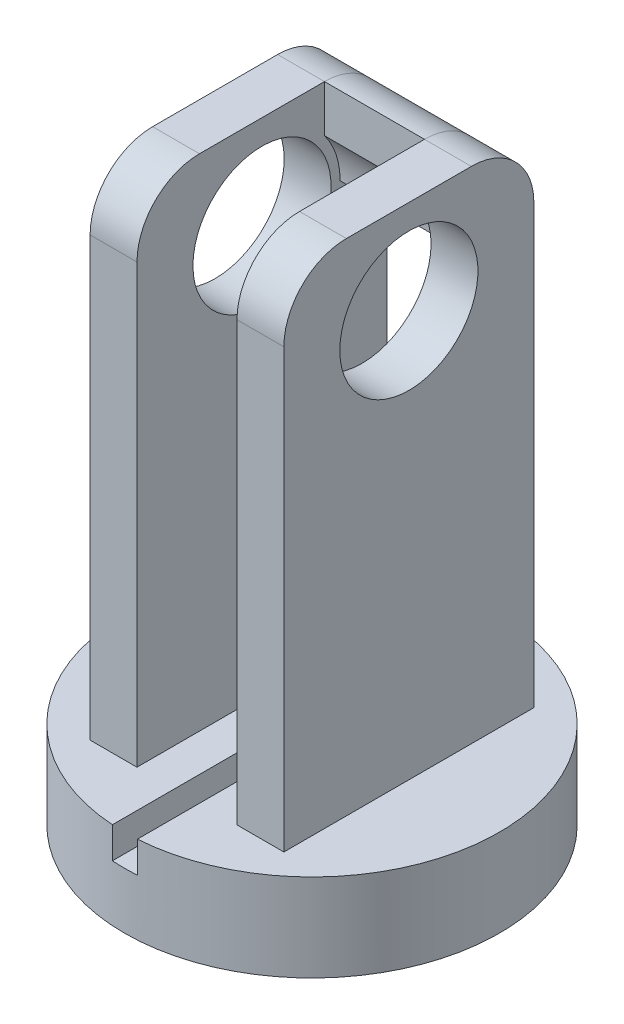
ISO-10303-21;
HEADER;
FILE_DESCRIPTION(('STEP AP214'),'2;1');
FILE_NAME('part.step','',(''),(''),'','','');
FILE_SCHEMA(('AUTOMOTIVE_DESIGN { 1 0 10303 214 1 1 1 1 }'));
ENDSEC;
DATA;
#1=APPLICATION_CONTEXT('core data for automotive mechanical design processes');
#2=APPLICATION_PROTOCOL_DEFINITION('international standard','automotive_design',2000,#1);
#3=PRODUCT_CONTEXT('',#1,'mechanical');
#4=PRODUCT('Part','Part','',(#3));
#5=PRODUCT_RELATED_PRODUCT_CATEGORY('part','',(#4));
#6=PRODUCT_DEFINITION_FORMATION('','',#4);
#7=PRODUCT_DEFINITION_CONTEXT('part definition',#1,'design');
#8=PRODUCT_DEFINITION('design','',#6,#7);
#9=PRODUCT_DEFINITION_SHAPE('','',#8);
#10=(LENGTH_UNIT() NAMED_UNIT(*) SI_UNIT(.MILLI.,.METRE.));
#11=(NAMED_UNIT(*) PLANE_ANGLE_UNIT() SI_UNIT($,.RADIAN.));
#12=(NAMED_UNIT(*) SI_UNIT($,.STERADIAN.) SOLID_ANGLE_UNIT());
#13=UNCERTAINTY_MEASURE_WITH_UNIT(LENGTH_MEASURE(1.E-05),#10,'distance_accuracy_value','');
#14=(GEOMETRIC_REPRESENTATION_CONTEXT(3) GLOBAL_UNCERTAINTY_ASSIGNED_CONTEXT((#13)) GLOBAL_UNIT_ASSIGNED_CONTEXT((#10,
#11,#12)) REPRESENTATION_CONTEXT('',''));
#15=CARTESIAN_POINT('',(0.,0.,0.));
#16=DIRECTION('',(0.,0.,1.));
#17=DIRECTION('',(1.,0.,0.));
#18=AXIS2_PLACEMENT_3D('',#15,#16,#17);
#19=CARTESIAN_POINT('',(-8.,94.,20.));
#20=DIRECTION('',(-1.,0.,0.));
#21=DIRECTION('',(0.,0.,1.));
#22=AXIS2_PLACEMENT_3D('',#19,#20,#21);
#23=PLANE('',#22);
#24=CARTESIAN_POINT('',(-8.,79.,0.));
#25=DIRECTION('',(-1.,0.,0.));
#26=DIRECTION('',(0.,0.,1.));
#27=AXIS2_PLACEMENT_3D('',#24,#25,#26);
#28=CIRCLE('',#27,11.05);
#29=CARTESIAN_POINT('',(-8.,79.,11.05));
#30=VERTEX_POINT('',#29);
#31=EDGE_CURVE('E255',#30,#30,#28,.T.);
#32=ORIENTED_EDGE('',*,*,#31,.T.);
#33=EDGE_LOOP('',(#32));
#34=FACE_BOUND('',#33,.T.);
#35=DIRECTION('',(0.,1.,0.));
#36=VECTOR('',#35,1.);
#37=CARTESIAN_POINT('',(-8.,86.5,-9.99999999999999));
#38=LINE('',#37,#36);
#39=CARTESIAN_POINT('',(-8.,86.5,-9.99999999999999));
#40=VERTEX_POINT('',#39);
#41=CARTESIAN_POINT('',(-8.,94.,-9.99999999999999));
#42=VERTEX_POINT('',#41);
#43=EDGE_CURVE('E187',#40,#42,#38,.T.);
#44=ORIENTED_EDGE('',*,*,#43,.T.);
#45=DIRECTION('',(0.,0.,-1.));
#46=VECTOR('',#45,1.);
#47=CARTESIAN_POINT('',(-8.,94.,20.));
#48=LINE('',#47,#46);
#49=CARTESIAN_POINT('',(-8.,94.,10.));
#50=VERTEX_POINT('',#49);
#51=EDGE_CURVE('E180',#50,#42,#48,.T.);
#52=ORIENTED_EDGE('',*,*,#51,.F.);
#53=CARTESIAN_POINT('',(-8.,84.,10.));
#54=DIRECTION('',(-1.,0.,0.));
#55=DIRECTION('',(0.,0.,1.));
#56=AXIS2_PLACEMENT_3D('',#53,#54,#55);
#57=CIRCLE('',#56,10.);
#58=CARTESIAN_POINT('',(-8.,84.,20.));
#59=VERTEX_POINT('',#58);
#60=EDGE_CURVE('E203',#50,#59,#57,.F.);
#61=ORIENTED_EDGE('',*,*,#60,.T.);
#62=DIRECTION('',(0.,-1.,0.));
#63=VECTOR('',#62,1.);
#64=CARTESIAN_POINT('',(-8.,94.,20.));
#65=LINE('',#64,#63);
#66=CARTESIAN_POINT('',(-8.,14.,20.));
#67=VERTEX_POINT('',#66);
#68=EDGE_CURVE('E302',#59,#67,#65,.T.);
#69=ORIENTED_EDGE('',*,*,#68,.T.);
#70=DIRECTION('',(0.,0.,-1.));
#71=VECTOR('',#70,1.);
#72=CARTESIAN_POINT('',(-8.,14.,20.));
#73=LINE('',#72,#71);
#74=CARTESIAN_POINT('',(-8.,14.,-20.));
#75=VERTEX_POINT('',#74);
#76=EDGE_CURVE('E289',#67,#75,#73,.T.);
#77=ORIENTED_EDGE('',*,*,#76,.T.);
#78=DIRECTION('',(0.,-1.,0.));
#79=VECTOR('',#78,1.);
#80=CARTESIAN_POINT('',(-8.,94.,-20.));
#81=LINE('',#80,#79);
#82=CARTESIAN_POINT('',(-8.,79.,-20.));
#83=VERTEX_POINT('',#82);
#84=EDGE_CURVE('E300',#83,#75,#81,.T.);
#85=ORIENTED_EDGE('',*,*,#84,.F.);
#86=DIRECTION('',(0.,0.,-1.));
#87=VECTOR('',#86,1.);
#88=CARTESIAN_POINT('',(-8.,79.,-12.5));
#89=LINE('',#88,#87);
#90=CARTESIAN_POINT('',(-8.,79.,-12.5));
#91=VERTEX_POINT('',#90);
#92=EDGE_CURVE('E53',#91,#83,#89,.T.);
#93=ORIENTED_EDGE('',*,*,#92,.F.);
#94=CARTESIAN_POINT('',(-8.,79.,0.));
#95=DIRECTION('',(-1.,0.,0.));
#96=DIRECTION('',(0.,0.,1.));
#97=AXIS2_PLACEMENT_3D('',#94,#95,#96);
#98=CIRCLE('',#97,12.5);
#99=EDGE_CURVE('E48',#40,#91,#98,.T.);
#100=ORIENTED_EDGE('',*,*,#99,.F.);
#101=EDGE_LOOP('',(#44,#52,#61,#69,#77,#85,#93,#100));
#102=FACE_BOUND('',#101,.T.);
#103=ADVANCED_FACE('F33',(#34,#102),#23,.F.);
#104=CARTESIAN_POINT('',(8.,94.,-20.));
#105=DIRECTION('',(1.,0.,0.));
#106=DIRECTION('',(0.,0.,-1.));
#107=AXIS2_PLACEMENT_3D('',#104,#105,#106);
#108=PLANE('',#107);
#109=CARTESIAN_POINT('',(8.,79.,0.));
#110=DIRECTION('',(1.,0.,0.));
#111=DIRECTION('',(0.,0.,-1.));
#112=AXIS2_PLACEMENT_3D('',#109,#110,#111);
#113=CIRCLE('',#112,11.05);
#114=CARTESIAN_POINT('',(8.,79.,-11.05));
#115=VERTEX_POINT('',#114);
#116=EDGE_CURVE('E226',#115,#115,#113,.T.);
#117=ORIENTED_EDGE('',*,*,#116,.T.);
#118=EDGE_LOOP('',(#117));
#119=FACE_BOUND('',#118,.T.);
#120=DIRECTION('',(0.,1.,0.));
#121=VECTOR('',#120,1.);
#122=CARTESIAN_POINT('',(8.,86.5,-9.99999999999999));
#123=LINE('',#122,#121);
#124=CARTESIAN_POINT('',(8.,86.5,-9.99999999999999));
#125=VERTEX_POINT('',#124);
#126=CARTESIAN_POINT('',(8.,94.,-10.));
#127=VERTEX_POINT('',#126);
#128=EDGE_CURVE('E197',#125,#127,#123,.T.);
#129=ORIENTED_EDGE('',*,*,#128,.F.);
#130=CARTESIAN_POINT('',(8.,79.,0.));
#131=DIRECTION('',(-1.,0.,0.));
#132=DIRECTION('',(0.,0.,1.));
#133=AXIS2_PLACEMENT_3D('',#130,#131,#132);
#134=CIRCLE('',#133,12.5);
#135=CARTESIAN_POINT('',(8.,79.,-12.5));
#136=VERTEX_POINT('',#135);
#137=EDGE_CURVE('E191',#125,#136,#134,.T.);
#138=ORIENTED_EDGE('',*,*,#137,.T.);
#139=DIRECTION('',(0.,0.,-1.));
#140=VECTOR('',#139,1.);
#141=CARTESIAN_POINT('',(8.,79.,-12.5));
#142=LINE('',#141,#140);
#143=CARTESIAN_POINT('',(8.,79.,-20.));
#144=VERTEX_POINT('',#143);
#145=EDGE_CURVE('E200',#136,#144,#142,.T.);
#146=ORIENTED_EDGE('',*,*,#145,.T.);
#147=DIRECTION('',(0.,-1.,0.));
#148=VECTOR('',#147,1.);
#149=CARTESIAN_POINT('',(8.,94.,-20.));
#150=LINE('',#149,#148);
#151=CARTESIAN_POINT('',(8.,14.,-20.));
#152=VERTEX_POINT('',#151);
#153=EDGE_CURVE('E278',#144,#152,#150,.T.);
#154=ORIENTED_EDGE('',*,*,#153,.T.);
#155=DIRECTION('',(0.,0.,1.));
#156=VECTOR('',#155,1.);
#157=CARTESIAN_POINT('',(8.,14.,-20.));
#158=LINE('',#157,#156);
#159=CARTESIAN_POINT('',(8.,14.,20.));
#160=VERTEX_POINT('',#159);
#161=EDGE_CURVE('E263',#152,#160,#158,.T.);
#162=ORIENTED_EDGE('',*,*,#161,.T.);
#163=DIRECTION('',(0.,-1.,0.));
#164=VECTOR('',#163,1.);
#165=CARTESIAN_POINT('',(8.,94.,20.));
#166=LINE('',#165,#164);
#167=CARTESIAN_POINT('',(8.,84.,20.));
#168=VERTEX_POINT('',#167);
#169=EDGE_CURVE('E266',#168,#160,#166,.T.);
#170=ORIENTED_EDGE('',*,*,#169,.F.);
#171=CARTESIAN_POINT('',(8.,84.,10.));
#172=DIRECTION('',(1.,0.,0.));
#173=DIRECTION('',(0.,0.,-1.));
#174=AXIS2_PLACEMENT_3D('',#171,#172,#173);
#175=CIRCLE('',#174,10.);
#176=CARTESIAN_POINT('',(8.,94.,10.));
#177=VERTEX_POINT('',#176);
#178=EDGE_CURVE('E214',#168,#177,#175,.F.);
#179=ORIENTED_EDGE('',*,*,#178,.T.);
#180=DIRECTION('',(0.,0.,1.));
#181=VECTOR('',#180,1.);
#182=CARTESIAN_POINT('',(8.,94.,-20.));
#183=LINE('',#182,#181);
#184=EDGE_CURVE('E262',#127,#177,#183,.T.);
#185=ORIENTED_EDGE('',*,*,#184,.F.);
#186=EDGE_LOOP('',(#129,#138,#146,#154,#162,#170,#179,#185));
#187=FACE_BOUND('',#186,.T.);
#188=ADVANCED_FACE('F395',(#119,#187),#108,.F.);
#189=CARTESIAN_POINT('',(0.,14.,0.));
#190=DIRECTION('',(0.,1.,0.));
#191=DIRECTION('',(0.,0.,1.));
#192=AXIS2_PLACEMENT_3D('',#189,#190,#191);
#193=PLANE('',#192);
#194=DIRECTION('',(0.,0.,-1.));
#195=VECTOR('',#194,1.);
#196=CARTESIAN_POINT('',(2.,14.,-29.9332590941915));
#197=LINE('',#196,#195);
#198=CARTESIAN_POINT('',(2.,14.,29.9332590941915));
#199=VERTEX_POINT('',#198);
#200=CARTESIAN_POINT('',(2.,14.,-29.9332590941915));
#201=VERTEX_POINT('',#200);
#202=EDGE_CURVE('E245',#199,#201,#197,.T.);
#203=ORIENTED_EDGE('',*,*,#202,.F.);
#204=CARTESIAN_POINT('',(0.,14.,0.));
#205=DIRECTION('',(0.,1.,0.));
#206=DIRECTION('',(0.,0.,1.));
#207=AXIS2_PLACEMENT_3D('',#204,#205,#206);
#208=CIRCLE('',#207,30.);
#209=EDGE_CURVE('E311',#199,#201,#208,.T.);
#210=ORIENTED_EDGE('',*,*,#209,.T.);
#211=EDGE_LOOP('',(#203,#210));
#212=FACE_BOUND('',#211,.T.);
#213=DIRECTION('',(0.,0.,-1.));
#214=VECTOR('',#213,1.);
#215=CARTESIAN_POINT('',(15.5,14.,20.));
#216=LINE('',#215,#214);
#217=CARTESIAN_POINT('',(15.5,14.,20.));
#218=VERTEX_POINT('',#217);
#219=CARTESIAN_POINT('',(15.5,14.,-20.));
#220=VERTEX_POINT('',#219);
#221=EDGE_CURVE('E269',#218,#220,#216,.T.);
#222=ORIENTED_EDGE('',*,*,#221,.F.);
#223=DIRECTION('',(1.,0.,0.));
#224=VECTOR('',#223,1.);
#225=CARTESIAN_POINT('',(8.,14.,20.));
#226=LINE('',#225,#224);
#227=EDGE_CURVE('E258',#160,#218,#226,.T.);
#228=ORIENTED_EDGE('',*,*,#227,.F.);
#229=ORIENTED_EDGE('',*,*,#161,.F.);
#230=DIRECTION('',(-1.,0.,0.));
#231=VECTOR('',#230,1.);
#232=CARTESIAN_POINT('',(15.5,14.,-20.));
#233=LINE('',#232,#231);
#234=EDGE_CURVE('E272',#220,#152,#233,.T.);
#235=ORIENTED_EDGE('',*,*,#234,.F.);
#236=EDGE_LOOP('',(#222,#228,#229,#235));
#237=FACE_BOUND('',#236,.T.);
#238=ADVANCED_FACE('F373',(#212,#237),#193,.T.);
#239=DIRECTION('',(0.,0.,1.));
#240=VECTOR('',#239,1.);
#241=CARTESIAN_POINT('',(-2.,14.,-29.9332590941915));
#242=LINE('',#241,#240);
#243=CARTESIAN_POINT('',(-2.,14.,-29.9332590941915));
#244=VERTEX_POINT('',#243);
#245=CARTESIAN_POINT('',(-2.,14.,29.9332590941915));
#246=VERTEX_POINT('',#245);
#247=EDGE_CURVE('E344',#244,#246,#242,.T.);
#248=ORIENTED_EDGE('',*,*,#247,.F.);
#249=EDGE_CURVE('E313',#244,#246,#208,.T.);
#250=ORIENTED_EDGE('',*,*,#249,.T.);
#251=EDGE_LOOP('',(#248,#250));
#252=FACE_BOUND('',#251,.T.);
#253=ORIENTED_EDGE('',*,*,#76,.F.);
#254=DIRECTION('',(1.,0.,0.));
#255=VECTOR('',#254,1.);
#256=CARTESIAN_POINT('',(-15.5,14.,20.));
#257=LINE('',#256,#255);
#258=CARTESIAN_POINT('',(-15.5,14.,20.));
#259=VERTEX_POINT('',#258);
#260=EDGE_CURVE('E283',#259,#67,#257,.T.);
#261=ORIENTED_EDGE('',*,*,#260,.F.);
#262=DIRECTION('',(0.,0.,1.));
#263=VECTOR('',#262,1.);
#264=CARTESIAN_POINT('',(-15.5,14.,-20.));
#265=LINE('',#264,#263);
#266=CARTESIAN_POINT('',(-15.5,14.,-20.));
#267=VERTEX_POINT('',#266);
#268=EDGE_CURVE('E184',#267,#259,#265,.T.);
#269=ORIENTED_EDGE('',*,*,#268,.F.);
#270=DIRECTION('',(-1.,0.,0.));
#271=VECTOR('',#270,1.);
#272=CARTESIAN_POINT('',(-8.,14.,-20.));
#273=LINE('',#272,#271);
#274=EDGE_CURVE('E292',#75,#267,#273,.T.);
#275=ORIENTED_EDGE('',*,*,#274,.F.);
#276=EDGE_LOOP('',(#253,#261,#269,#275));
#277=FACE_BOUND('',#276,.T.);
#278=ADVANCED_FACE('F337',(#252,#277),#193,.T.);
#279=CARTESIAN_POINT('',(0.,14.,0.));
#280=DIRECTION('',(0.,-1.,0.));
#281=DIRECTION('',(0.,0.,-1.));
#282=AXIS2_PLACEMENT_3D('',#279,#280,#281);
#283=CYLINDRICAL_SURFACE('',#282,30.);
#284=CARTESIAN_POINT('',(0.,9.,0.));
#285=DIRECTION('',(0.,1.,0.));
#286=DIRECTION('',(0.,0.,1.));
#287=AXIS2_PLACEMENT_3D('',#284,#285,#286);
#288=CIRCLE('',#287,30.);
#289=CARTESIAN_POINT('',(2.,9.,-29.9332590941915));
#290=VERTEX_POINT('',#289);
#291=CARTESIAN_POINT('',(-2.,9.,-29.9332590941915));
#292=VERTEX_POINT('',#291);
#293=EDGE_CURVE('E356',#290,#292,#288,.T.);
#294=ORIENTED_EDGE('',*,*,#293,.F.);
#295=DIRECTION('',(0.,1.,0.));
#296=VECTOR('',#295,1.);
#297=CARTESIAN_POINT('',(2.,9.,-29.9332590941915));
#298=LINE('',#297,#296);
#299=EDGE_CURVE('E229',#290,#201,#298,.T.);
#300=ORIENTED_EDGE('',*,*,#299,.T.);
#301=ORIENTED_EDGE('',*,*,#209,.F.);
#302=DIRECTION('',(0.,1.,0.));
#303=VECTOR('',#302,1.);
#304=CARTESIAN_POINT('',(2.,9.,29.9332590941915));
#305=LINE('',#304,#303);
#306=CARTESIAN_POINT('',(2.,9.,29.9332590941915));
#307=VERTEX_POINT('',#306);
#308=EDGE_CURVE('E236',#307,#199,#305,.T.);
#309=ORIENTED_EDGE('',*,*,#308,.F.);
#310=CARTESIAN_POINT('',(0.,9.,0.));
#311=DIRECTION('',(0.,1.,0.));
#312=DIRECTION('',(0.,0.,1.));
#313=AXIS2_PLACEMENT_3D('',#310,#311,#312);
#314=CIRCLE('',#313,30.);
#315=CARTESIAN_POINT('',(-2.,9.,29.9332590941915));
#316=VERTEX_POINT('',#315);
#317=EDGE_CURVE('E361',#316,#307,#314,.T.);
#318=ORIENTED_EDGE('',*,*,#317,.F.);
#319=DIRECTION('',(0.,1.,0.));
#320=VECTOR('',#319,1.);
#321=CARTESIAN_POINT('',(-2.,9.,29.9332590941915));
#322=LINE('',#321,#320);
#323=EDGE_CURVE('E242',#316,#246,#322,.T.);
#324=ORIENTED_EDGE('',*,*,#323,.T.);
#325=ORIENTED_EDGE('',*,*,#249,.F.);
#326=DIRECTION('',(0.,1.,0.));
#327=VECTOR('',#326,1.);
#328=CARTESIAN_POINT('',(-2.,9.,-29.9332590941915));
#329=LINE('',#328,#327);
#330=EDGE_CURVE('E250',#292,#244,#329,.T.);
#331=ORIENTED_EDGE('',*,*,#330,.F.);
#332=EDGE_LOOP('',(#294,#300,#301,#309,#318,#324,#325,#331));
#333=FACE_BOUND('',#332,.T.);
#334=CARTESIAN_POINT('',(0.,0.,0.));
#335=DIRECTION('',(0.,1.,0.));
#336=DIRECTION('',(0.,0.,1.));
#337=AXIS2_PLACEMENT_3D('',#334,#335,#336);
#338=CIRCLE('',#337,30.);
#339=CARTESIAN_POINT('',(0.,0.,30.));
#340=VERTEX_POINT('',#339);
#341=EDGE_CURVE('E308',#340,#340,#338,.T.);
#342=ORIENTED_EDGE('',*,*,#341,.T.);
#343=EDGE_LOOP('',(#342));
#344=FACE_BOUND('',#343,.T.);
#345=ADVANCED_FACE('F375',(#333,#344),#283,.T.);
#346=CARTESIAN_POINT('',(0.,0.,0.));
#347=DIRECTION('',(0.,1.,0.));
#348=DIRECTION('',(0.,0.,1.));
#349=AXIS2_PLACEMENT_3D('',#346,#347,#348);
#350=PLANE('',#349);
#351=CARTESIAN_POINT('',(0.,0.,0.));
#352=DIRECTION('',(0.,-1.,0.));
#353=DIRECTION('',(0.,0.,-1.));
#354=AXIS2_PLACEMENT_3D('',#351,#352,#353);
#355=CIRCLE('',#354,11.05);
#356=CARTESIAN_POINT('',(0.,0.,-11.05));
#357=VERTEX_POINT('',#356);
#358=EDGE_CURVE('E304',#357,#357,#355,.T.);
#359=ORIENTED_EDGE('',*,*,#358,.F.);
#360=EDGE_LOOP('',(#359));
#361=FACE_BOUND('',#360,.T.);
#362=ORIENTED_EDGE('',*,*,#341,.F.);
#363=EDGE_LOOP('',(#362));
#364=FACE_BOUND('',#363,.T.);
#365=ADVANCED_FACE('F414',(#361,#364),#350,.F.);
#366=CARTESIAN_POINT('',(0.,7.,0.));
#367=DIRECTION('',(0.,-1.,0.));
#368=DIRECTION('',(0.,0.,-1.));
#369=AXIS2_PLACEMENT_3D('',#366,#367,#368);
#370=CYLINDRICAL_SURFACE('',#369,11.05);
#371=CARTESIAN_POINT('',(0.,7.,0.));
#372=DIRECTION('',(0.,-1.,0.));
#373=DIRECTION('',(0.,0.,-1.));
#374=AXIS2_PLACEMENT_3D('',#371,#372,#373);
#375=CIRCLE('',#374,11.05);
#376=CARTESIAN_POINT('',(0.,7.,-11.05));
#377=VERTEX_POINT('',#376);
#378=EDGE_CURVE('E305',#377,#377,#375,.T.);
#379=CARTESIAN_POINT('',(0.,7.,-11.05));
#380=CARTESIAN_POINT('',(0.,6.92708333333333,-11.05));
#381=CARTESIAN_POINT('',(0.,6.85416666666667,-11.05));
#382=CARTESIAN_POINT('',(0.,6.70833333333333,-11.05));
#383=CARTESIAN_POINT('',(0.,6.63541666666667,-11.05));
#384=CARTESIAN_POINT('',(0.,6.48958333333333,-11.05));
#385=CARTESIAN_POINT('',(0.,6.41666666666667,-11.05));
#386=CARTESIAN_POINT('',(0.,6.27083333333333,-11.05));
#387=CARTESIAN_POINT('',(0.,6.19791666666667,-11.05));
#388=CARTESIAN_POINT('',(0.,6.05208333333333,-11.05));
#389=CARTESIAN_POINT('',(0.,5.97916666666667,-11.05));
#390=CARTESIAN_POINT('',(0.,5.83333333333333,-11.05));
#391=CARTESIAN_POINT('',(0.,5.76041666666667,-11.05));
#392=CARTESIAN_POINT('',(0.,5.61458333333333,-11.05));
#393=CARTESIAN_POINT('',(0.,5.54166666666667,-11.05));
#394=CARTESIAN_POINT('',(0.,5.39583333333333,-11.05));
#395=CARTESIAN_POINT('',(0.,5.32291666666667,-11.05));
#396=CARTESIAN_POINT('',(0.,5.17708333333333,-11.05));
#397=CARTESIAN_POINT('',(0.,5.10416666666667,-11.05));
#398=CARTESIAN_POINT('',(0.,4.95833333333333,-11.05));
#399=CARTESIAN_POINT('',(0.,4.88541666666667,-11.05));
#400=CARTESIAN_POINT('',(0.,4.73958333333333,-11.05));
#401=CARTESIAN_POINT('',(0.,4.66666666666667,-11.05));
#402=CARTESIAN_POINT('',(0.,4.52083333333333,-11.05));
#403=CARTESIAN_POINT('',(0.,4.44791666666667,-11.05));
#404=CARTESIAN_POINT('',(0.,4.30208333333333,-11.05));
#405=CARTESIAN_POINT('',(0.,4.22916666666667,-11.05));
#406=CARTESIAN_POINT('',(0.,4.08333333333333,-11.05));
#407=CARTESIAN_POINT('',(0.,4.01041666666667,-11.05));
#408=CARTESIAN_POINT('',(0.,3.86458333333333,-11.05));
#409=CARTESIAN_POINT('',(0.,3.79166666666667,-11.05));
#410=CARTESIAN_POINT('',(0.,3.64583333333333,-11.05));
#411=CARTESIAN_POINT('',(0.,3.57291666666667,-11.05));
#412=CARTESIAN_POINT('',(0.,3.42708333333333,-11.05));
#413=CARTESIAN_POINT('',(0.,3.35416666666667,-11.05));
#414=CARTESIAN_POINT('',(0.,3.20833333333333,-11.05));
#415=CARTESIAN_POINT('',(0.,3.13541666666667,-11.05));
#416=CARTESIAN_POINT('',(0.,2.98958333333333,-11.05));
#417=CARTESIAN_POINT('',(0.,2.91666666666667,-11.05));
#418=CARTESIAN_POINT('',(0.,2.77083333333333,-11.05));
#419=CARTESIAN_POINT('',(0.,2.69791666666667,-11.05));
#420=CARTESIAN_POINT('',(0.,2.55208333333333,-11.05));
#421=CARTESIAN_POINT('',(0.,2.47916666666667,-11.05));
#422=CARTESIAN_POINT('',(0.,2.33333333333333,-11.05));
#423=CARTESIAN_POINT('',(0.,2.26041666666667,-11.05));
#424=CARTESIAN_POINT('',(0.,2.11458333333333,-11.05));
#425=CARTESIAN_POINT('',(0.,2.04166666666667,-11.05));
#426=CARTESIAN_POINT('',(0.,1.89583333333333,-11.05));
#427=CARTESIAN_POINT('',(0.,1.82291666666667,-11.05));
#428=CARTESIAN_POINT('',(0.,1.67708333333333,-11.05));
#429=CARTESIAN_POINT('',(0.,1.60416666666667,-11.05));
#430=CARTESIAN_POINT('',(0.,1.45833333333333,-11.05));
#431=CARTESIAN_POINT('',(0.,1.38541666666667,-11.05));
#432=CARTESIAN_POINT('',(0.,1.23958333333333,-11.05));
#433=CARTESIAN_POINT('',(0.,1.16666666666667,-11.05));
#434=CARTESIAN_POINT('',(0.,1.02083333333333,-11.05));
#435=CARTESIAN_POINT('',(0.,0.947916666666668,-11.05));
#436=CARTESIAN_POINT('',(0.,0.802083333333334,-11.05));
#437=CARTESIAN_POINT('',(0.,0.729166666666667,-11.05));
#438=CARTESIAN_POINT('',(0.,0.583333333333334,-11.05));
#439=CARTESIAN_POINT('',(0.,0.510416666666668,-11.05));
#440=CARTESIAN_POINT('',(0.,0.364583333333335,-11.05));
#441=CARTESIAN_POINT('',(0.,0.291666666666668,-11.05));
#442=CARTESIAN_POINT('',(0.,0.145833333333334,-11.05));
#443=CARTESIAN_POINT('',(0.,0.0729166666666675,-11.05));
#444=CARTESIAN_POINT('',(0.,0.,-11.05));
#445=B_SPLINE_CURVE_WITH_KNOTS('',3,(#379,#380,#381,#382,#383,#384,#385,#386,#387,#388,#389,
#390,#391,#392,#393,#394,#395,#396,#397,#398,#399,#400,#401,#402,#403,#404,#405,#406,#407,#408,
#409,#410,#411,#412,#413,#414,#415,#416,#417,#418,#419,#420,#421,#422,#423,#424,#425,#426,#427,
#428,#429,#430,#431,#432,#433,#434,#435,#436,#437,#438,#439,#440,#441,#442,#443,#444),
.UNSPECIFIED.,.F.,.F.,(4,2,2,2,2,2,2,2,2,2,2,2,2,2,2,2,2,2,2,2,2,2,2,2,2,2,2,2,2,2,2,2,4),(0.,
0.21875,0.4375,0.656250000000001,0.875,1.09375,1.3125,1.53125,1.75,1.96875,2.1875,2.40625,2.625,
2.84375,3.0625,3.28125,3.5,3.71875,3.9375,4.15625,4.375,4.59375,4.8125,5.03125,5.25,5.46875,
5.6875,5.90625,6.125,6.34375,6.5625,6.78125,7.),.UNSPECIFIED.);
#446=EDGE_CURVE('BSEAM410',#377,#357,#445,.T.);
#447=ORIENTED_EDGE('',*,*,#378,.F.);
#448=ORIENTED_EDGE('',*,*,#358,.T.);
#449=ORIENTED_EDGE('',*,*,#446,.T.);
#450=ORIENTED_EDGE('',*,*,#446,.F.);
#451=EDGE_LOOP('',(#447,#449,#448,#450));
#452=FACE_BOUND('',#451,.T.);
#453=ADVANCED_FACE('F410',(#452),#370,.F.);
#454=CARTESIAN_POINT('',(0.,7.,0.));
#455=DIRECTION('',(0.,-1.,0.));
#456=DIRECTION('',(0.,0.,-1.));
#457=AXIS2_PLACEMENT_3D('',#454,#455,#456);
#458=PLANE('',#457);
#459=ORIENTED_EDGE('',*,*,#378,.T.);
#460=EDGE_LOOP('',(#459));
#461=FACE_BOUND('',#460,.T.);
#462=ADVANCED_FACE('F407',(#461),#458,.T.);
#463=CARTESIAN_POINT('',(-15.5,94.,20.));
#464=DIRECTION('',(0.,0.,-1.));
#465=DIRECTION('',(-1.,0.,0.));
#466=AXIS2_PLACEMENT_3D('',#463,#464,#465);
#467=PLANE('',#466);
#468=ORIENTED_EDGE('',*,*,#68,.F.);
#469=DIRECTION('',(1.,0.,0.));
#470=VECTOR('',#469,1.);
#471=CARTESIAN_POINT('',(-15.5,84.,20.));
#472=LINE('',#471,#470);
#473=CARTESIAN_POINT('',(-15.5,84.,20.));
#474=VERTEX_POINT('',#473);
#475=EDGE_CURVE('E41',#59,#474,#472,.F.);
#476=ORIENTED_EDGE('',*,*,#475,.T.);
#477=DIRECTION('',(0.,-1.,0.));
#478=VECTOR('',#477,1.);
#479=CARTESIAN_POINT('',(-15.5,94.,20.));
#480=LINE('',#479,#478);
#481=EDGE_CURVE('E286',#474,#259,#480,.T.);
#482=ORIENTED_EDGE('',*,*,#481,.T.);
#483=ORIENTED_EDGE('',*,*,#260,.T.);
#484=EDGE_LOOP('',(#468,#476,#482,#483));
#485=FACE_BOUND('',#484,.T.);
#486=ADVANCED_FACE('F334',(#485),#467,.F.);
#487=CARTESIAN_POINT('',(-8.,94.,-20.));
#488=DIRECTION('',(0.,0.,1.));
#489=DIRECTION('',(1.,0.,0.));
#490=AXIS2_PLACEMENT_3D('',#487,#488,#489);
#491=PLANE('',#490);
#492=DIRECTION('',(-1.,0.,0.));
#493=VECTOR('',#492,1.);
#494=CARTESIAN_POINT('',(-8.,84.,-20.));
#495=LINE('',#494,#493);
#496=CARTESIAN_POINT('',(-15.5,84.,-20.));
#497=VERTEX_POINT('',#496);
#498=CARTESIAN_POINT('',(-8.,84.,-20.));
#499=VERTEX_POINT('',#498);
#500=EDGE_CURVE('E208',#497,#499,#495,.F.);
#501=ORIENTED_EDGE('',*,*,#500,.T.);
#502=DIRECTION('',(1.,0.,0.));
#503=VECTOR('',#502,1.);
#504=CARTESIAN_POINT('',(8.,84.,-20.));
#505=LINE('',#504,#503);
#506=CARTESIAN_POINT('',(8.,84.,-20.));
#507=VERTEX_POINT('',#506);
#508=EDGE_CURVE('E11',#499,#507,#505,.T.);
#509=ORIENTED_EDGE('',*,*,#508,.T.);
#510=DIRECTION('',(-1.,0.,0.));
#511=VECTOR('',#510,1.);
#512=CARTESIAN_POINT('',(15.5,84.,-20.));
#513=LINE('',#512,#511);
#514=CARTESIAN_POINT('',(15.5,84.,-20.));
#515=VERTEX_POINT('',#514);
#516=EDGE_CURVE('E218',#507,#515,#513,.F.);
#517=ORIENTED_EDGE('',*,*,#516,.T.);
#518=DIRECTION('',(0.,-1.,0.));
#519=VECTOR('',#518,1.);
#520=CARTESIAN_POINT('',(15.5,94.,-20.));
#521=LINE('',#520,#519);
#522=EDGE_CURVE('E280',#515,#220,#521,.T.);
#523=ORIENTED_EDGE('',*,*,#522,.T.);
#524=ORIENTED_EDGE('',*,*,#234,.T.);
#525=ORIENTED_EDGE('',*,*,#153,.F.);
#526=DIRECTION('',(1.,0.,0.));
#527=VECTOR('',#526,1.);
#528=CARTESIAN_POINT('',(-26.0277563773199,79.,-20.));
#529=LINE('',#528,#527);
#530=EDGE_CURVE('E341',#83,#144,#529,.T.);
#531=ORIENTED_EDGE('',*,*,#530,.F.);
#532=ORIENTED_EDGE('',*,*,#84,.T.);
#533=ORIENTED_EDGE('',*,*,#274,.T.);
#534=DIRECTION('',(0.,-1.,0.));
#535=VECTOR('',#534,1.);
#536=CARTESIAN_POINT('',(-15.5,94.,-20.));
#537=LINE('',#536,#535);
#538=EDGE_CURVE('E298',#497,#267,#537,.T.);
#539=ORIENTED_EDGE('',*,*,#538,.F.);
#540=EDGE_LOOP('',(#501,#509,#517,#523,#524,#525,#531,#532,#533,#539));
#541=FACE_BOUND('',#540,.T.);
#542=ADVANCED_FACE('F320',(#541),#491,.F.);
#543=CARTESIAN_POINT('',(-15.5,94.,-20.));
#544=DIRECTION('',(1.,0.,0.));
#545=DIRECTION('',(0.,0.,-1.));
#546=AXIS2_PLACEMENT_3D('',#543,#544,#545);
#547=PLANE('',#546);
#548=CARTESIAN_POINT('',(-15.5,79.,0.));
#549=DIRECTION('',(1.,0.,0.));
#550=DIRECTION('',(0.,0.,-1.));
#551=AXIS2_PLACEMENT_3D('',#548,#549,#550);
#552=CIRCLE('',#551,11.05);
#553=CARTESIAN_POINT('',(-15.5,79.,-11.05));
#554=VERTEX_POINT('',#553);
#555=EDGE_CURVE('E233',#554,#554,#552,.T.);
#556=ORIENTED_EDGE('',*,*,#555,.T.);
#557=EDGE_LOOP('',(#556));
#558=FACE_BOUND('',#557,.T.);
#559=DIRECTION('',(0.,0.,1.));
#560=VECTOR('',#559,1.);
#561=CARTESIAN_POINT('',(-15.5,94.,-20.));
#562=LINE('',#561,#560);
#563=CARTESIAN_POINT('',(-15.5,94.,-10.));
#564=VERTEX_POINT('',#563);
#565=CARTESIAN_POINT('',(-15.5,94.,10.));
#566=VERTEX_POINT('',#565);
#567=EDGE_CURVE('E183',#564,#566,#562,.T.);
#568=ORIENTED_EDGE('',*,*,#567,.F.);
#569=CARTESIAN_POINT('',(-15.5,84.,-10.));
#570=DIRECTION('',(1.,0.,0.));
#571=DIRECTION('',(0.,0.,-1.));
#572=AXIS2_PLACEMENT_3D('',#569,#570,#571);
#573=CIRCLE('',#572,10.);
#574=EDGE_CURVE('E171',#564,#497,#573,.F.);
#575=ORIENTED_EDGE('',*,*,#574,.T.);
#576=ORIENTED_EDGE('',*,*,#538,.T.);
#577=ORIENTED_EDGE('',*,*,#268,.T.);
#578=ORIENTED_EDGE('',*,*,#481,.F.);
#579=CARTESIAN_POINT('',(-15.5,84.,10.));
#580=DIRECTION('',(1.,0.,0.));
#581=DIRECTION('',(0.,0.,-1.));
#582=AXIS2_PLACEMENT_3D('',#579,#580,#581);
#583=CIRCLE('',#582,10.);
#584=EDGE_CURVE('E175',#474,#566,#583,.F.);
#585=ORIENTED_EDGE('',*,*,#584,.T.);
#586=EDGE_LOOP('',(#568,#575,#576,#577,#578,#585));
#587=FACE_BOUND('',#586,.T.);
#588=ADVANCED_FACE('F325',(#558,#587),#547,.F.);
#589=CARTESIAN_POINT('',(0.,94.,0.));
#590=DIRECTION('',(0.,1.,0.));
#591=DIRECTION('',(0.,0.,1.));
#592=AXIS2_PLACEMENT_3D('',#589,#590,#591);
#593=PLANE('',#592);
#594=ORIENTED_EDGE('',*,*,#51,.T.);
#595=DIRECTION('',(-1.,0.,0.));
#596=VECTOR('',#595,1.);
#597=CARTESIAN_POINT('',(-15.5,94.,-10.));
#598=LINE('',#597,#596);
#599=EDGE_CURVE('E164',#42,#564,#598,.T.);
#600=ORIENTED_EDGE('',*,*,#599,.T.);
#601=ORIENTED_EDGE('',*,*,#567,.T.);
#602=DIRECTION('',(1.,0.,0.));
#603=VECTOR('',#602,1.);
#604=CARTESIAN_POINT('',(-7.99999999999999,94.,10.));
#605=LINE('',#604,#603);
#606=EDGE_CURVE('E176',#566,#50,#605,.T.);
#607=ORIENTED_EDGE('',*,*,#606,.T.);
#608=EDGE_LOOP('',(#594,#600,#601,#607));
#609=FACE_BOUND('',#608,.T.);
#610=ADVANCED_FACE('F181',(#609),#593,.T.);
#611=CARTESIAN_POINT('',(8.,94.,20.));
#612=DIRECTION('',(0.,0.,-1.));
#613=DIRECTION('',(-1.,0.,0.));
#614=AXIS2_PLACEMENT_3D('',#611,#612,#613);
#615=PLANE('',#614);
#616=DIRECTION('',(0.,-1.,0.));
#617=VECTOR('',#616,1.);
#618=CARTESIAN_POINT('',(15.5,94.,20.));
#619=LINE('',#618,#617);
#620=CARTESIAN_POINT('',(15.5,84.,20.));
#621=VERTEX_POINT('',#620);
#622=EDGE_CURVE('E282',#621,#218,#619,.T.);
#623=ORIENTED_EDGE('',*,*,#622,.F.);
#624=DIRECTION('',(1.,0.,0.));
#625=VECTOR('',#624,1.);
#626=CARTESIAN_POINT('',(8.,84.,20.));
#627=LINE('',#626,#625);
#628=EDGE_CURVE('E224',#621,#168,#627,.F.);
#629=ORIENTED_EDGE('',*,*,#628,.T.);
#630=ORIENTED_EDGE('',*,*,#169,.T.);
#631=ORIENTED_EDGE('',*,*,#227,.T.);
#632=EDGE_LOOP('',(#623,#629,#630,#631));
#633=FACE_BOUND('',#632,.T.);
#634=ADVANCED_FACE('F452',(#633),#615,.F.);
#635=CARTESIAN_POINT('',(15.5,94.,20.));
#636=DIRECTION('',(-1.,0.,0.));
#637=DIRECTION('',(0.,0.,1.));
#638=AXIS2_PLACEMENT_3D('',#635,#636,#637);
#639=PLANE('',#638);
#640=CARTESIAN_POINT('',(15.5,79.,0.));
#641=DIRECTION('',(-1.,0.,0.));
#642=DIRECTION('',(0.,0.,1.));
#643=AXIS2_PLACEMENT_3D('',#640,#641,#642);
#644=CIRCLE('',#643,11.05);
#645=CARTESIAN_POINT('',(15.5,79.,11.05));
#646=VERTEX_POINT('',#645);
#647=EDGE_CURVE('E228',#646,#646,#644,.T.);
#648=ORIENTED_EDGE('',*,*,#647,.T.);
#649=EDGE_LOOP('',(#648));
#650=FACE_BOUND('',#649,.T.);
#651=ORIENTED_EDGE('',*,*,#522,.F.);
#652=CARTESIAN_POINT('',(15.5,84.,-10.));
#653=DIRECTION('',(-1.,0.,0.));
#654=DIRECTION('',(0.,0.,1.));
#655=AXIS2_PLACEMENT_3D('',#652,#653,#654);
#656=CIRCLE('',#655,10.);
#657=CARTESIAN_POINT('',(15.5,94.,-9.99999999999999));
#658=VERTEX_POINT('',#657);
#659=EDGE_CURVE('E222',#515,#658,#656,.F.);
#660=ORIENTED_EDGE('',*,*,#659,.T.);
#661=DIRECTION('',(0.,0.,-1.));
#662=VECTOR('',#661,1.);
#663=CARTESIAN_POINT('',(15.5,94.,20.));
#664=LINE('',#663,#662);
#665=CARTESIAN_POINT('',(15.5,94.,10.));
#666=VERTEX_POINT('',#665);
#667=EDGE_CURVE('E259',#666,#658,#664,.T.);
#668=ORIENTED_EDGE('',*,*,#667,.F.);
#669=CARTESIAN_POINT('',(15.5,84.,10.));
#670=DIRECTION('',(-1.,0.,0.));
#671=DIRECTION('',(0.,0.,1.));
#672=AXIS2_PLACEMENT_3D('',#669,#670,#671);
#673=CIRCLE('',#672,10.);
#674=EDGE_CURVE('E220',#666,#621,#673,.F.);
#675=ORIENTED_EDGE('',*,*,#674,.T.);
#676=ORIENTED_EDGE('',*,*,#622,.T.);
#677=ORIENTED_EDGE('',*,*,#221,.T.);
#678=EDGE_LOOP('',(#651,#660,#668,#675,#676,#677));
#679=FACE_BOUND('',#678,.T.);
#680=ADVANCED_FACE('F447',(#650,#679),#639,.F.);
#681=CARTESIAN_POINT('',(0.,94.,0.));
#682=DIRECTION('',(0.,1.,0.));
#683=DIRECTION('',(0.,0.,1.));
#684=AXIS2_PLACEMENT_3D('',#681,#682,#683);
#685=PLANE('',#684);
#686=ORIENTED_EDGE('',*,*,#667,.T.);
#687=DIRECTION('',(-1.,0.,0.));
#688=VECTOR('',#687,1.);
#689=CARTESIAN_POINT('',(7.99999999999999,94.,-10.));
#690=LINE('',#689,#688);
#691=EDGE_CURVE('E206',#658,#127,#690,.T.);
#692=ORIENTED_EDGE('',*,*,#691,.T.);
#693=ORIENTED_EDGE('',*,*,#184,.T.);
#694=DIRECTION('',(1.,0.,0.));
#695=VECTOR('',#694,1.);
#696=CARTESIAN_POINT('',(15.5,94.,10.));
#697=LINE('',#696,#695);
#698=EDGE_CURVE('E202',#177,#666,#697,.T.);
#699=ORIENTED_EDGE('',*,*,#698,.T.);
#700=EDGE_LOOP('',(#686,#692,#693,#699));
#701=FACE_BOUND('',#700,.T.);
#702=ADVANCED_FACE('F427',(#701),#685,.T.);
#703=CARTESIAN_POINT('',(0.,84.,-10.));
#704=DIRECTION('',(1.,0.,0.));
#705=DIRECTION('',(0.,0.,-1.));
#706=AXIS2_PLACEMENT_3D('',#703,#704,#705);
#707=CYLINDRICAL_SURFACE('',#706,10.);
#708=CARTESIAN_POINT('',(-8.,84.,-10.));
#709=DIRECTION('',(-1.,0.,0.));
#710=DIRECTION('',(0.,0.,1.));
#711=AXIS2_PLACEMENT_3D('',#708,#709,#710);
#712=CIRCLE('',#711,10.);
#713=EDGE_CURVE('E169',#499,#42,#712,.F.);
#714=ORIENTED_EDGE('',*,*,#713,.F.);
#715=ORIENTED_EDGE('',*,*,#500,.F.);
#716=ORIENTED_EDGE('',*,*,#574,.F.);
#717=ORIENTED_EDGE('',*,*,#599,.F.);
#718=EDGE_LOOP('',(#714,#715,#716,#717));
#719=FACE_BOUND('',#718,.T.);
#720=ADVANCED_FACE('F166',(#719),#707,.T.);
#721=CARTESIAN_POINT('',(0.,84.,-10.));
#722=DIRECTION('',(1.,0.,0.));
#723=DIRECTION('',(0.,0.,-1.));
#724=AXIS2_PLACEMENT_3D('',#721,#722,#723);
#725=CYLINDRICAL_SURFACE('',#724,10.);
#726=ORIENTED_EDGE('',*,*,#659,.F.);
#727=ORIENTED_EDGE('',*,*,#516,.F.);
#728=CARTESIAN_POINT('',(8.,84.,-10.));
#729=DIRECTION('',(1.,0.,0.));
#730=DIRECTION('',(0.,0.,-1.));
#731=AXIS2_PLACEMENT_3D('',#728,#729,#730);
#732=CIRCLE('',#731,10.);
#733=EDGE_CURVE('E216',#127,#507,#732,.F.);
#734=ORIENTED_EDGE('',*,*,#733,.F.);
#735=ORIENTED_EDGE('',*,*,#691,.F.);
#736=EDGE_LOOP('',(#726,#727,#734,#735));
#737=FACE_BOUND('',#736,.T.);
#738=ADVANCED_FACE('F426',(#737),#725,.T.);
#739=CARTESIAN_POINT('',(0.,84.,10.));
#740=DIRECTION('',(-1.,0.,0.));
#741=DIRECTION('',(0.,0.,1.));
#742=AXIS2_PLACEMENT_3D('',#739,#740,#741);
#743=CYLINDRICAL_SURFACE('',#742,10.);
#744=ORIENTED_EDGE('',*,*,#178,.F.);
#745=ORIENTED_EDGE('',*,*,#628,.F.);
#746=ORIENTED_EDGE('',*,*,#674,.F.);
#747=ORIENTED_EDGE('',*,*,#698,.F.);
#748=EDGE_LOOP('',(#744,#745,#746,#747));
#749=FACE_BOUND('',#748,.T.);
#750=ADVANCED_FACE('F430',(#749),#743,.T.);
#751=CARTESIAN_POINT('',(0.,84.,10.));
#752=DIRECTION('',(-1.,0.,0.));
#753=DIRECTION('',(0.,0.,1.));
#754=AXIS2_PLACEMENT_3D('',#751,#752,#753);
#755=CYLINDRICAL_SURFACE('',#754,10.);
#756=ORIENTED_EDGE('',*,*,#584,.F.);
#757=ORIENTED_EDGE('',*,*,#475,.F.);
#758=ORIENTED_EDGE('',*,*,#60,.F.);
#759=ORIENTED_EDGE('',*,*,#606,.F.);
#760=EDGE_LOOP('',(#756,#757,#758,#759));
#761=FACE_BOUND('',#760,.T.);
#762=ADVANCED_FACE('F330',(#761),#755,.T.);
#763=CARTESIAN_POINT('',(30.,79.,0.));
#764=DIRECTION('',(-1.,0.,0.));
#765=DIRECTION('',(0.,0.,1.));
#766=AXIS2_PLACEMENT_3D('',#763,#764,#765);
#767=CYLINDRICAL_SURFACE('',#766,11.05);
#768=ORIENTED_EDGE('',*,*,#116,.F.);
#769=EDGE_LOOP('',(#768));
#770=FACE_BOUND('',#769,.T.);
#771=ORIENTED_EDGE('',*,*,#647,.F.);
#772=EDGE_LOOP('',(#771));
#773=FACE_BOUND('',#772,.T.);
#774=ADVANCED_FACE('F435',(#770,#773),#767,.F.);
#775=ORIENTED_EDGE('',*,*,#555,.F.);
#776=EDGE_LOOP('',(#775));
#777=FACE_BOUND('',#776,.T.);
#778=ORIENTED_EDGE('',*,*,#31,.F.);
#779=EDGE_LOOP('',(#778));
#780=FACE_BOUND('',#779,.T.);
#781=ADVANCED_FACE('F391',(#777,#780),#767,.F.);
#782=CARTESIAN_POINT('',(2.,9.,-29.9332590941915));
#783=DIRECTION('',(1.,0.,0.));
#784=DIRECTION('',(0.,0.,-1.));
#785=AXIS2_PLACEMENT_3D('',#782,#783,#784);
#786=PLANE('',#785);
#787=ORIENTED_EDGE('',*,*,#202,.T.);
#788=ORIENTED_EDGE('',*,*,#299,.F.);
#789=DIRECTION('',(0.,0.,-1.));
#790=VECTOR('',#789,1.);
#791=CARTESIAN_POINT('',(2.,9.,-29.9332590941915));
#792=LINE('',#791,#790);
#793=EDGE_CURVE('E251',#307,#290,#792,.T.);
#794=ORIENTED_EDGE('',*,*,#793,.F.);
#795=ORIENTED_EDGE('',*,*,#308,.T.);
#796=EDGE_LOOP('',(#787,#788,#794,#795));
#797=FACE_BOUND('',#796,.T.);
#798=ADVANCED_FACE('F369',(#797),#786,.F.);
#799=CARTESIAN_POINT('',(-2.,9.,-29.9332590941915));
#800=DIRECTION('',(-1.,0.,0.));
#801=DIRECTION('',(0.,0.,1.));
#802=AXIS2_PLACEMENT_3D('',#799,#800,#801);
#803=PLANE('',#802);
#804=ORIENTED_EDGE('',*,*,#247,.T.);
#805=ORIENTED_EDGE('',*,*,#323,.F.);
#806=DIRECTION('',(0.,0.,1.));
#807=VECTOR('',#806,1.);
#808=CARTESIAN_POINT('',(-2.,9.,-29.9332590941915));
#809=LINE('',#808,#807);
#810=EDGE_CURVE('E359',#292,#316,#809,.T.);
#811=ORIENTED_EDGE('',*,*,#810,.F.);
#812=ORIENTED_EDGE('',*,*,#330,.T.);
#813=EDGE_LOOP('',(#804,#805,#811,#812));
#814=FACE_BOUND('',#813,.T.);
#815=ADVANCED_FACE('F383',(#814),#803,.F.);
#816=CARTESIAN_POINT('',(0.,9.,0.));
#817=DIRECTION('',(0.,1.,0.));
#818=DIRECTION('',(0.,0.,1.));
#819=AXIS2_PLACEMENT_3D('',#816,#817,#818);
#820=PLANE('',#819);
#821=ORIENTED_EDGE('',*,*,#293,.T.);
#822=ORIENTED_EDGE('',*,*,#810,.T.);
#823=ORIENTED_EDGE('',*,*,#317,.T.);
#824=ORIENTED_EDGE('',*,*,#793,.T.);
#825=EDGE_LOOP('',(#821,#822,#823,#824));
#826=FACE_BOUND('',#825,.T.);
#827=ADVANCED_FACE('F381',(#826),#820,.T.);
#828=CARTESIAN_POINT('',(-26.0277563773199,86.5,-9.99999999999999));
#829=DIRECTION('',(0.,0.,-1.));
#830=DIRECTION('',(-1.,0.,0.));
#831=AXIS2_PLACEMENT_3D('',#828,#829,#830);
#832=PLANE('',#831);
#833=ORIENTED_EDGE('',*,*,#43,.F.);
#834=DIRECTION('',(1.,0.,0.));
#835=VECTOR('',#834,1.);
#836=CARTESIAN_POINT('',(-26.0277563773199,86.5,-9.99999999999999));
#837=LINE('',#836,#835);
#838=EDGE_CURVE('E199',#40,#125,#837,.T.);
#839=ORIENTED_EDGE('',*,*,#838,.T.);
#840=ORIENTED_EDGE('',*,*,#128,.T.);
#841=DIRECTION('',(1.,0.,0.));
#842=VECTOR('',#841,1.);
#843=CARTESIAN_POINT('',(-26.0277563773199,94.,-9.99999999999999));
#844=LINE('',#843,#842);
#845=EDGE_CURVE('E195',#42,#127,#844,.T.);
#846=ORIENTED_EDGE('',*,*,#845,.F.);
#847=EDGE_LOOP('',(#833,#839,#840,#846));
#848=FACE_BOUND('',#847,.T.);
#849=ADVANCED_FACE('F196',(#848),#832,.F.);
#850=CARTESIAN_POINT('',(-26.0277563773199,79.,0.));
#851=DIRECTION('',(1.,0.,0.));
#852=DIRECTION('',(0.,0.,-1.));
#853=AXIS2_PLACEMENT_3D('',#850,#851,#852);
#854=CYLINDRICAL_SURFACE('',#853,12.5);
#855=ORIENTED_EDGE('',*,*,#838,.F.);
#856=ORIENTED_EDGE('',*,*,#99,.T.);
#857=DIRECTION('',(1.,0.,0.));
#858=VECTOR('',#857,1.);
#859=CARTESIAN_POINT('',(-26.0277563773199,79.,-12.5));
#860=LINE('',#859,#858);
#861=EDGE_CURVE('E348',#91,#136,#860,.T.);
#862=ORIENTED_EDGE('',*,*,#861,.T.);
#863=ORIENTED_EDGE('',*,*,#137,.F.);
#864=EDGE_LOOP('',(#855,#856,#862,#863));
#865=FACE_BOUND('',#864,.T.);
#866=ADVANCED_FACE('F520',(#865),#854,.F.);
#867=CARTESIAN_POINT('',(-26.0277563773199,79.,-12.5));
#868=DIRECTION('',(0.,-1.,0.));
#869=DIRECTION('',(0.,0.,-1.));
#870=AXIS2_PLACEMENT_3D('',#867,#868,#869);
#871=PLANE('',#870);
#872=ORIENTED_EDGE('',*,*,#861,.F.);
#873=ORIENTED_EDGE('',*,*,#92,.T.);
#874=ORIENTED_EDGE('',*,*,#530,.T.);
#875=ORIENTED_EDGE('',*,*,#145,.F.);
#876=EDGE_LOOP('',(#872,#873,#874,#875));
#877=FACE_BOUND('',#876,.T.);
#878=ADVANCED_FACE('F346',(#877),#871,.T.);
#879=CARTESIAN_POINT('',(-8.,84.,-10.));
#880=DIRECTION('',(-1.,0.,0.));
#881=DIRECTION('',(0.,0.,1.));
#882=AXIS2_PLACEMENT_3D('',#879,#880,#881);
#883=CYLINDRICAL_SURFACE('',#882,10.);
#884=ORIENTED_EDGE('',*,*,#713,.T.);
#885=ORIENTED_EDGE('',*,*,#845,.T.);
#886=ORIENTED_EDGE('',*,*,#733,.T.);
#887=ORIENTED_EDGE('',*,*,#508,.F.);
#888=EDGE_LOOP('',(#884,#885,#886,#887));
#889=FACE_BOUND('',#888,.T.);
#890=ADVANCED_FACE('F35',(#889),#883,.T.);
#891=CLOSED_SHELL('',(#103,#188,#238,#278,#345,#365,#453,#462,#486,#542,#588,#610,#634,#680,
#702,#720,#738,#750,#762,#774,#781,#798,#815,#827,#849,#866,#878,#890));
#892=MANIFOLD_SOLID_BREP('B2',#891);
#893=ADVANCED_BREP_SHAPE_REPRESENTATION('',(#18,#892),#14);
#894=SHAPE_DEFINITION_REPRESENTATION(#9,#893);
ENDSEC;
END-ISO-10303-21;
